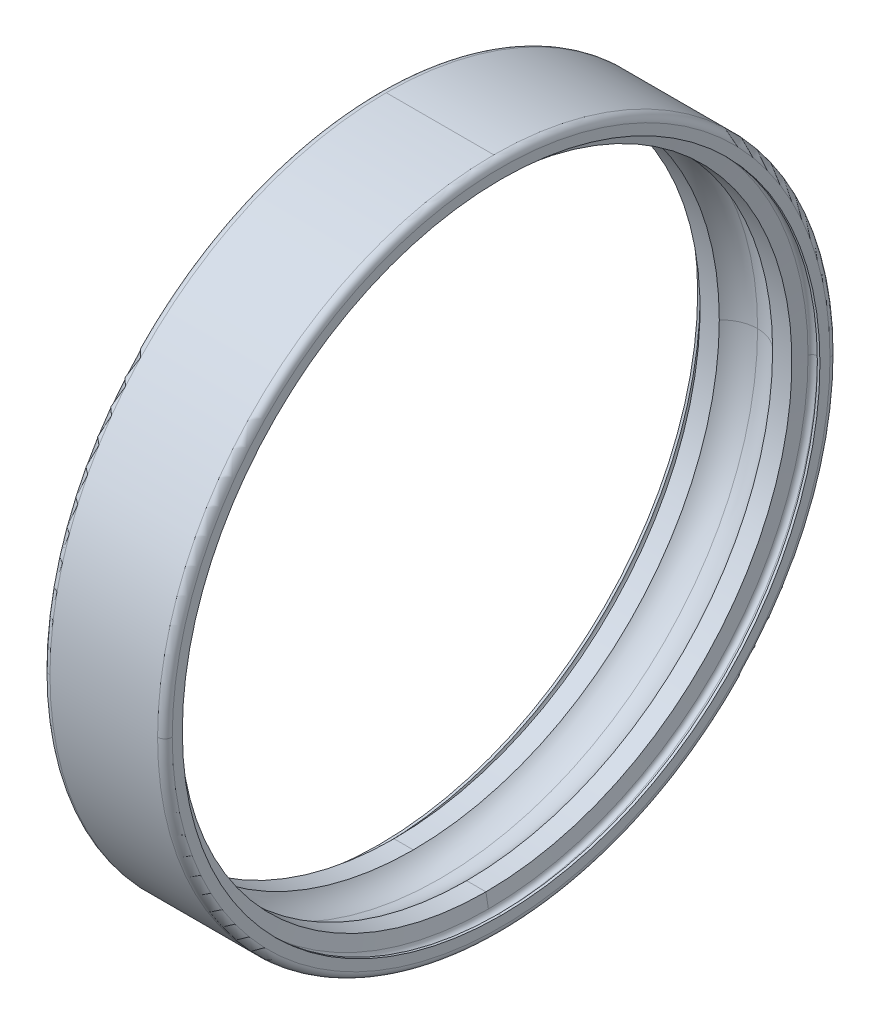
ISO-10303-21;
HEADER;
FILE_DESCRIPTION(('STEP AP214'),'2;1');
FILE_NAME('part.step','',(''),(''),'','','');
FILE_SCHEMA(('AUTOMOTIVE_DESIGN { 1 0 10303 214 1 1 1 1 }'));
ENDSEC;
DATA;
#1=APPLICATION_CONTEXT('core data for automotive mechanical design processes');
#2=APPLICATION_PROTOCOL_DEFINITION('international standard','automotive_design',2000,#1);
#3=PRODUCT_CONTEXT('',#1,'mechanical');
#4=PRODUCT('Part','Part','',(#3));
#5=PRODUCT_RELATED_PRODUCT_CATEGORY('part','',(#4));
#6=PRODUCT_DEFINITION_FORMATION('','',#4);
#7=PRODUCT_DEFINITION_CONTEXT('part definition',#1,'design');
#8=PRODUCT_DEFINITION('design','',#6,#7);
#9=PRODUCT_DEFINITION_SHAPE('','',#8);
#10=(LENGTH_UNIT() NAMED_UNIT(*) SI_UNIT(.MILLI.,.METRE.));
#11=(NAMED_UNIT(*) PLANE_ANGLE_UNIT() SI_UNIT($,.RADIAN.));
#12=(NAMED_UNIT(*) SI_UNIT($,.STERADIAN.) SOLID_ANGLE_UNIT());
#13=UNCERTAINTY_MEASURE_WITH_UNIT(LENGTH_MEASURE(1.E-05),#10,'distance_accuracy_value','');
#14=(GEOMETRIC_REPRESENTATION_CONTEXT(3) GLOBAL_UNCERTAINTY_ASSIGNED_CONTEXT((#13)) GLOBAL_UNIT_ASSIGNED_CONTEXT((#10,
#11,#12)) REPRESENTATION_CONTEXT('',''));
#15=CARTESIAN_POINT('',(0.,0.,0.));
#16=DIRECTION('',(0.,0.,1.));
#17=DIRECTION('',(1.,0.,0.));
#18=AXIS2_PLACEMENT_3D('',#15,#16,#17);
#19=CARTESIAN_POINT('',(9.37,0.,0.));
#20=DIRECTION('',(1.,0.,0.));
#21=DIRECTION('',(0.,0.,-1.));
#22=AXIS2_PLACEMENT_3D('',#19,#20,#21);
#23=TOROIDAL_SURFACE('',#22,26.075,0.42);
#24=CARTESIAN_POINT('',(9.37,0.,0.));
#25=DIRECTION('',(1.,0.,0.));
#26=DIRECTION('',(0.,0.,1.));
#27=AXIS2_PLACEMENT_3D('',#24,#25,#26);
#28=CIRCLE('',#27,26.495);
#29=CARTESIAN_POINT('',(9.37,0.,-26.495));
#30=VERTEX_POINT('',#29);
#31=CARTESIAN_POINT('',(9.37,0.,26.495));
#32=VERTEX_POINT('',#31);
#33=EDGE_CURVE('E434',#30,#32,#28,.T.);
#34=ORIENTED_EDGE('',*,*,#33,.T.);
#35=CARTESIAN_POINT('',(9.37,0.,26.075));
#36=DIRECTION('',(0.,-1.,0.));
#37=DIRECTION('',(0.,0.,1.));
#38=AXIS2_PLACEMENT_3D('',#35,#36,#37);
#39=CIRCLE('',#38,0.42);
#40=CARTESIAN_POINT('',(8.95638074373487,0.,26.1479322346201));
#41=VERTEX_POINT('',#40);
#42=EDGE_CURVE('E278',#32,#41,#39,.T.);
#43=ORIENTED_EDGE('',*,*,#42,.T.);
#44=CARTESIAN_POINT('',(8.95638074373487,0.,0.));
#45=DIRECTION('',(1.,0.,0.));
#46=DIRECTION('',(0.,1.,0.));
#47=AXIS2_PLACEMENT_3D('',#44,#45,#46);
#48=CIRCLE('',#47,26.1479322346201);
#49=CARTESIAN_POINT('',(8.95638074373487,26.1479322346201,0.));
#50=VERTEX_POINT('',#49);
#51=EDGE_CURVE('E31',#50,#41,#48,.T.);
#52=ORIENTED_EDGE('',*,*,#51,.F.);
#53=CARTESIAN_POINT('',(8.95638074373487,0.,0.));
#54=DIRECTION('',(1.,0.,0.));
#55=DIRECTION('',(0.,1.,0.));
#56=AXIS2_PLACEMENT_3D('',#53,#54,#55);
#57=CIRCLE('',#56,26.1479322346201);
#58=CARTESIAN_POINT('',(8.95638074373487,0.,-26.1479322346201));
#59=VERTEX_POINT('',#58);
#60=EDGE_CURVE('E220',#59,#50,#57,.T.);
#61=ORIENTED_EDGE('',*,*,#60,.F.);
#62=CARTESIAN_POINT('',(9.37,0.,-26.075));
#63=DIRECTION('',(0.,-1.,0.));
#64=DIRECTION('',(0.,0.,-1.));
#65=AXIS2_PLACEMENT_3D('',#62,#63,#64);
#66=CIRCLE('',#65,0.42);
#67=EDGE_CURVE('E410',#59,#30,#66,.T.);
#68=ORIENTED_EDGE('',*,*,#67,.T.);
#69=EDGE_LOOP('',(#34,#43,#52,#61,#68));
#70=FACE_BOUND('',#69,.T.);
#71=ADVANCED_FACE('F15',(#70),#23,.F.);
#72=CARTESIAN_POINT('',(9.895,0.,0.));
#73=DIRECTION('',(1.,0.,0.));
#74=DIRECTION('',(0.,1.,0.));
#75=AXIS2_PLACEMENT_3D('',#72,#73,#74);
#76=CYLINDRICAL_SURFACE('',#75,26.075);
#77=DIRECTION('',(1.,0.,0.));
#78=VECTOR('',#77,1.);
#79=CARTESIAN_POINT('',(9.895,26.075,0.));
#80=LINE('',#79,#78);
#81=CARTESIAN_POINT('',(9.79,26.075,0.));
#82=VERTEX_POINT('',#81);
#83=CARTESIAN_POINT('',(10.,26.075,0.));
#84=VERTEX_POINT('',#83);
#85=EDGE_CURVE('E279',#82,#84,#80,.T.);
#86=ORIENTED_EDGE('',*,*,#85,.T.);
#87=CARTESIAN_POINT('',(10.,0.,0.));
#88=DIRECTION('',(1.,0.,0.));
#89=DIRECTION('',(0.,1.,0.));
#90=AXIS2_PLACEMENT_3D('',#87,#88,#89);
#91=CIRCLE('',#90,26.075);
#92=CARTESIAN_POINT('',(10.,-26.075,0.));
#93=VERTEX_POINT('',#92);
#94=EDGE_CURVE('E10',#84,#93,#91,.T.);
#95=ORIENTED_EDGE('',*,*,#94,.T.);
#96=DIRECTION('',(-1.,0.,0.));
#97=VECTOR('',#96,1.);
#98=CARTESIAN_POINT('',(9.895,-26.075,0.));
#99=LINE('',#98,#97);
#100=CARTESIAN_POINT('',(9.79,-26.075,0.));
#101=VERTEX_POINT('',#100);
#102=EDGE_CURVE('E283',#93,#101,#99,.T.);
#103=ORIENTED_EDGE('',*,*,#102,.T.);
#104=CARTESIAN_POINT('',(9.79,0.,0.));
#105=DIRECTION('',(1.,0.,0.));
#106=DIRECTION('',(0.,1.,0.));
#107=AXIS2_PLACEMENT_3D('',#104,#105,#106);
#108=CIRCLE('',#107,26.075);
#109=CARTESIAN_POINT('',(9.79,0.,26.075));
#110=VERTEX_POINT('',#109);
#111=EDGE_CURVE('E405',#110,#101,#108,.T.);
#112=ORIENTED_EDGE('',*,*,#111,.F.);
#113=CARTESIAN_POINT('',(9.79,0.,0.));
#114=DIRECTION('',(1.,0.,0.));
#115=DIRECTION('',(0.,1.,0.));
#116=AXIS2_PLACEMENT_3D('',#113,#114,#115);
#117=CIRCLE('',#116,26.075);
#118=EDGE_CURVE('E355',#82,#110,#117,.T.);
#119=ORIENTED_EDGE('',*,*,#118,.F.);
#120=EDGE_LOOP('',(#86,#95,#103,#112,#119));
#121=FACE_BOUND('',#120,.T.);
#122=ADVANCED_FACE('F17',(#121),#76,.F.);
#123=CARTESIAN_POINT('',(10.,26.4875,0.));
#124=DIRECTION('',(1.,0.,0.));
#125=DIRECTION('',(0.,1.,0.));
#126=AXIS2_PLACEMENT_3D('',#123,#124,#125);
#127=PLANE('',#126);
#128=ORIENTED_EDGE('',*,*,#94,.F.);
#129=CARTESIAN_POINT('',(10.,0.,0.));
#130=DIRECTION('',(1.,0.,0.));
#131=DIRECTION('',(0.,1.,0.));
#132=AXIS2_PLACEMENT_3D('',#129,#130,#131);
#133=CIRCLE('',#132,26.075);
#134=EDGE_CURVE('E286',#93,#84,#133,.T.);
#135=ORIENTED_EDGE('',*,*,#134,.F.);
#136=EDGE_LOOP('',(#128,#135));
#137=FACE_BOUND('',#136,.T.);
#138=CARTESIAN_POINT('',(10.,0.,0.));
#139=DIRECTION('',(1.,0.,0.));
#140=DIRECTION('',(0.,1.,0.));
#141=AXIS2_PLACEMENT_3D('',#138,#139,#140);
#142=CIRCLE('',#141,26.9);
#143=CARTESIAN_POINT('',(10.,0.,26.9));
#144=VERTEX_POINT('',#143);
#145=CARTESIAN_POINT('',(10.,0.,-26.9));
#146=VERTEX_POINT('',#145);
#147=EDGE_CURVE('E19',#144,#146,#142,.T.);
#148=ORIENTED_EDGE('',*,*,#147,.T.);
#149=CARTESIAN_POINT('',(10.,0.,0.));
#150=DIRECTION('',(1.,0.,0.));
#151=DIRECTION('',(0.,1.,0.));
#152=AXIS2_PLACEMENT_3D('',#149,#150,#151);
#153=CIRCLE('',#152,26.9);
#154=EDGE_CURVE('E301',#146,#144,#153,.T.);
#155=ORIENTED_EDGE('',*,*,#154,.T.);
#156=EDGE_LOOP('',(#148,#155));
#157=FACE_BOUND('',#156,.T.);
#158=ADVANCED_FACE('F455',(#137,#157),#127,.T.);
#159=CARTESIAN_POINT('',(9.4,0.,0.));
#160=DIRECTION('',(1.,0.,0.));
#161=DIRECTION('',(0.,0.,-1.));
#162=AXIS2_PLACEMENT_3D('',#159,#160,#161);
#163=TOROIDAL_SURFACE('',#162,26.9,0.6);
#164=CARTESIAN_POINT('',(9.4,0.,-26.9));
#165=DIRECTION('',(0.,-1.,0.));
#166=DIRECTION('',(0.,0.,-1.));
#167=AXIS2_PLACEMENT_3D('',#164,#165,#166);
#168=CIRCLE('',#167,0.6);
#169=CARTESIAN_POINT('',(9.4,0.,-27.5));
#170=VERTEX_POINT('',#169);
#171=EDGE_CURVE('E289',#170,#146,#168,.T.);
#172=ORIENTED_EDGE('',*,*,#171,.T.);
#173=ORIENTED_EDGE('',*,*,#147,.F.);
#174=CARTESIAN_POINT('',(9.4,0.,26.9));
#175=DIRECTION('',(0.,-1.,0.));
#176=DIRECTION('',(0.,0.,1.));
#177=AXIS2_PLACEMENT_3D('',#174,#175,#176);
#178=CIRCLE('',#177,0.6);
#179=CARTESIAN_POINT('',(9.4,0.,27.5));
#180=VERTEX_POINT('',#179);
#181=EDGE_CURVE('E298',#144,#180,#178,.T.);
#182=ORIENTED_EDGE('',*,*,#181,.T.);
#183=CARTESIAN_POINT('',(9.4,0.,0.));
#184=DIRECTION('',(1.,0.,0.));
#185=DIRECTION('',(0.,1.,0.));
#186=AXIS2_PLACEMENT_3D('',#183,#184,#185);
#187=CIRCLE('',#186,27.5);
#188=CARTESIAN_POINT('',(9.4,-27.5,0.));
#189=VERTEX_POINT('',#188);
#190=EDGE_CURVE('E314',#180,#189,#187,.T.);
#191=ORIENTED_EDGE('',*,*,#190,.T.);
#192=CARTESIAN_POINT('',(9.4,0.,0.));
#193=DIRECTION('',(1.,0.,0.));
#194=DIRECTION('',(0.,1.,0.));
#195=AXIS2_PLACEMENT_3D('',#192,#193,#194);
#196=CIRCLE('',#195,27.5);
#197=EDGE_CURVE('E223',#189,#170,#196,.T.);
#198=ORIENTED_EDGE('',*,*,#197,.T.);
#199=EDGE_LOOP('',(#172,#173,#182,#191,#198));
#200=FACE_BOUND('',#199,.T.);
#201=ADVANCED_FACE('F487',(#200),#163,.T.);
#202=CARTESIAN_POINT('',(5.,0.,0.));
#203=DIRECTION('',(1.,0.,0.));
#204=DIRECTION('',(0.,1.,0.));
#205=AXIS2_PLACEMENT_3D('',#202,#203,#204);
#206=CYLINDRICAL_SURFACE('',#205,27.5);
#207=DIRECTION('',(1.,0.,0.));
#208=VECTOR('',#207,1.);
#209=CARTESIAN_POINT('',(5.,27.5,0.));
#210=LINE('',#209,#208);
#211=CARTESIAN_POINT('',(0.6,27.5,0.));
#212=VERTEX_POINT('',#211);
#213=CARTESIAN_POINT('',(9.4,27.5,0.));
#214=VERTEX_POINT('',#213);
#215=EDGE_CURVE('E304',#212,#214,#210,.T.);
#216=ORIENTED_EDGE('',*,*,#215,.T.);
#217=CARTESIAN_POINT('',(9.4,0.,0.));
#218=DIRECTION('',(1.,0.,0.));
#219=DIRECTION('',(0.,1.,0.));
#220=AXIS2_PLACEMENT_3D('',#217,#218,#219);
#221=CIRCLE('',#220,27.5);
#222=EDGE_CURVE('E292',#170,#214,#221,.T.);
#223=ORIENTED_EDGE('',*,*,#222,.F.);
#224=ORIENTED_EDGE('',*,*,#197,.F.);
#225=DIRECTION('',(-1.,0.,0.));
#226=VECTOR('',#225,1.);
#227=CARTESIAN_POINT('',(5.,-27.5,0.));
#228=LINE('',#227,#226);
#229=CARTESIAN_POINT('',(0.6,-27.5,0.));
#230=VERTEX_POINT('',#229);
#231=EDGE_CURVE('E309',#189,#230,#228,.T.);
#232=ORIENTED_EDGE('',*,*,#231,.T.);
#233=CARTESIAN_POINT('',(0.6,0.,0.));
#234=DIRECTION('',(1.,0.,0.));
#235=DIRECTION('',(0.,1.,0.));
#236=AXIS2_PLACEMENT_3D('',#233,#234,#235);
#237=CIRCLE('',#236,27.5);
#238=CARTESIAN_POINT('',(0.6,0.,-27.5));
#239=VERTEX_POINT('',#238);
#240=EDGE_CURVE('E222',#230,#239,#237,.T.);
#241=ORIENTED_EDGE('',*,*,#240,.T.);
#242=CARTESIAN_POINT('',(0.6,0.,0.));
#243=DIRECTION('',(1.,0.,0.));
#244=DIRECTION('',(0.,1.,0.));
#245=AXIS2_PLACEMENT_3D('',#242,#243,#244);
#246=CIRCLE('',#245,27.5);
#247=EDGE_CURVE('E239',#239,#212,#246,.T.);
#248=ORIENTED_EDGE('',*,*,#247,.T.);
#249=EDGE_LOOP('',(#216,#223,#224,#232,#241,#248));
#250=FACE_BOUND('',#249,.T.);
#251=ADVANCED_FACE('F484',(#250),#206,.T.);
#252=CARTESIAN_POINT('',(0.6,0.,0.));
#253=DIRECTION('',(1.,0.,0.));
#254=DIRECTION('',(0.,0.,-1.));
#255=AXIS2_PLACEMENT_3D('',#252,#253,#254);
#256=TOROIDAL_SURFACE('',#255,26.9,0.6);
#257=CARTESIAN_POINT('',(0.6,0.,-26.9));
#258=DIRECTION('',(0.,-1.,0.));
#259=DIRECTION('',(0.,0.,-1.));
#260=AXIS2_PLACEMENT_3D('',#257,#258,#259);
#261=CIRCLE('',#260,0.6);
#262=CARTESIAN_POINT('',(0.,0.,-26.9));
#263=VERTEX_POINT('',#262);
#264=EDGE_CURVE('E311',#263,#239,#261,.T.);
#265=ORIENTED_EDGE('',*,*,#264,.T.);
#266=ORIENTED_EDGE('',*,*,#240,.F.);
#267=CARTESIAN_POINT('',(0.6,0.,0.));
#268=DIRECTION('',(1.,0.,0.));
#269=DIRECTION('',(0.,1.,0.));
#270=AXIS2_PLACEMENT_3D('',#267,#268,#269);
#271=CIRCLE('',#270,27.5);
#272=CARTESIAN_POINT('',(0.6,0.,27.5));
#273=VERTEX_POINT('',#272);
#274=EDGE_CURVE('E307',#273,#230,#271,.T.);
#275=ORIENTED_EDGE('',*,*,#274,.F.);
#276=CARTESIAN_POINT('',(0.6,0.,26.9));
#277=DIRECTION('',(0.,-1.,0.));
#278=DIRECTION('',(0.,0.,1.));
#279=AXIS2_PLACEMENT_3D('',#276,#277,#278);
#280=CIRCLE('',#279,0.6);
#281=CARTESIAN_POINT('',(0.,0.,26.9));
#282=VERTEX_POINT('',#281);
#283=EDGE_CURVE('E318',#273,#282,#280,.T.);
#284=ORIENTED_EDGE('',*,*,#283,.T.);
#285=CARTESIAN_POINT('',(0.,0.,0.));
#286=DIRECTION('',(1.,0.,0.));
#287=DIRECTION('',(0.,1.,0.));
#288=AXIS2_PLACEMENT_3D('',#285,#286,#287);
#289=CIRCLE('',#288,26.9);
#290=EDGE_CURVE('E224',#282,#263,#289,.T.);
#291=ORIENTED_EDGE('',*,*,#290,.T.);
#292=EDGE_LOOP('',(#265,#266,#275,#284,#291));
#293=FACE_BOUND('',#292,.T.);
#294=ADVANCED_FACE('F481',(#293),#256,.T.);
#295=CARTESIAN_POINT('',(0.,26.4875,0.));
#296=DIRECTION('',(-1.,0.,0.));
#297=DIRECTION('',(0.,0.,1.));
#298=AXIS2_PLACEMENT_3D('',#295,#296,#297);
#299=PLANE('',#298);
#300=CARTESIAN_POINT('',(0.,0.,0.));
#301=DIRECTION('',(1.,0.,0.));
#302=DIRECTION('',(0.,1.,0.));
#303=AXIS2_PLACEMENT_3D('',#300,#301,#302);
#304=CIRCLE('',#303,26.075);
#305=CARTESIAN_POINT('',(0.,26.075,0.));
#306=VERTEX_POINT('',#305);
#307=CARTESIAN_POINT('',(0.,-26.075,0.));
#308=VERTEX_POINT('',#307);
#309=EDGE_CURVE('E229',#306,#308,#304,.T.);
#310=ORIENTED_EDGE('',*,*,#309,.T.);
#311=CARTESIAN_POINT('',(0.,0.,0.));
#312=DIRECTION('',(1.,0.,0.));
#313=DIRECTION('',(0.,1.,0.));
#314=AXIS2_PLACEMENT_3D('',#311,#312,#313);
#315=CIRCLE('',#314,26.075);
#316=EDGE_CURVE('E241',#308,#306,#315,.T.);
#317=ORIENTED_EDGE('',*,*,#316,.T.);
#318=EDGE_LOOP('',(#310,#317));
#319=FACE_BOUND('',#318,.T.);
#320=CARTESIAN_POINT('',(0.,0.,0.));
#321=DIRECTION('',(1.,0.,0.));
#322=DIRECTION('',(0.,1.,0.));
#323=AXIS2_PLACEMENT_3D('',#320,#321,#322);
#324=CIRCLE('',#323,26.9);
#325=EDGE_CURVE('E313',#263,#282,#324,.T.);
#326=ORIENTED_EDGE('',*,*,#325,.F.);
#327=ORIENTED_EDGE('',*,*,#290,.F.);
#328=EDGE_LOOP('',(#326,#327));
#329=FACE_BOUND('',#328,.T.);
#330=ADVANCED_FACE('F341',(#319,#329),#299,.T.);
#331=CARTESIAN_POINT('',(0.105,0.,0.));
#332=DIRECTION('',(1.,0.,0.));
#333=DIRECTION('',(0.,1.,0.));
#334=AXIS2_PLACEMENT_3D('',#331,#332,#333);
#335=CYLINDRICAL_SURFACE('',#334,26.075);
#336=DIRECTION('',(1.,0.,0.));
#337=VECTOR('',#336,1.);
#338=CARTESIAN_POINT('',(0.105,26.075,0.));
#339=LINE('',#338,#337);
#340=CARTESIAN_POINT('',(0.21,26.075,0.));
#341=VERTEX_POINT('',#340);
#342=EDGE_CURVE('E245',#306,#341,#339,.T.);
#343=ORIENTED_EDGE('',*,*,#342,.T.);
#344=CARTESIAN_POINT('',(0.21,0.,0.));
#345=DIRECTION('',(1.,0.,0.));
#346=DIRECTION('',(0.,1.,0.));
#347=AXIS2_PLACEMENT_3D('',#344,#345,#346);
#348=CIRCLE('',#347,26.075);
#349=CARTESIAN_POINT('',(0.21,0.,26.075));
#350=VERTEX_POINT('',#349);
#351=EDGE_CURVE('E235',#341,#350,#348,.T.);
#352=ORIENTED_EDGE('',*,*,#351,.T.);
#353=CARTESIAN_POINT('',(0.21,0.,0.));
#354=DIRECTION('',(1.,0.,0.));
#355=DIRECTION('',(0.,1.,0.));
#356=AXIS2_PLACEMENT_3D('',#353,#354,#355);
#357=CIRCLE('',#356,26.075);
#358=CARTESIAN_POINT('',(0.21,-26.075,0.));
#359=VERTEX_POINT('',#358);
#360=EDGE_CURVE('E256',#350,#359,#357,.T.);
#361=ORIENTED_EDGE('',*,*,#360,.T.);
#362=DIRECTION('',(-1.,0.,0.));
#363=VECTOR('',#362,1.);
#364=CARTESIAN_POINT('',(0.105,-26.075,0.));
#365=LINE('',#364,#363);
#366=EDGE_CURVE('E244',#359,#308,#365,.T.);
#367=ORIENTED_EDGE('',*,*,#366,.T.);
#368=ORIENTED_EDGE('',*,*,#309,.F.);
#369=EDGE_LOOP('',(#343,#352,#361,#367,#368));
#370=FACE_BOUND('',#369,.T.);
#371=ADVANCED_FACE('F321',(#370),#335,.F.);
#372=CARTESIAN_POINT('',(0.63,0.,0.));
#373=DIRECTION('',(1.,0.,0.));
#374=DIRECTION('',(0.,0.,-1.));
#375=AXIS2_PLACEMENT_3D('',#372,#373,#374);
#376=TOROIDAL_SURFACE('',#375,26.075,0.42);
#377=CARTESIAN_POINT('',(0.63,0.,0.));
#378=DIRECTION('',(1.,0.,0.));
#379=DIRECTION('',(0.,0.,1.));
#380=AXIS2_PLACEMENT_3D('',#377,#378,#379);
#381=CIRCLE('',#380,26.495);
#382=CARTESIAN_POINT('',(0.63,0.,-26.495));
#383=VERTEX_POINT('',#382);
#384=CARTESIAN_POINT('',(0.63,0.,26.495));
#385=VERTEX_POINT('',#384);
#386=EDGE_CURVE('E331',#383,#385,#381,.T.);
#387=ORIENTED_EDGE('',*,*,#386,.T.);
#388=CARTESIAN_POINT('',(0.63,0.,26.075));
#389=DIRECTION('',(0.,-1.,0.));
#390=DIRECTION('',(0.,0.,1.));
#391=AXIS2_PLACEMENT_3D('',#388,#389,#390);
#392=CIRCLE('',#391,0.42);
#393=EDGE_CURVE('E258',#385,#350,#392,.T.);
#394=ORIENTED_EDGE('',*,*,#393,.T.);
#395=ORIENTED_EDGE('',*,*,#351,.F.);
#396=CARTESIAN_POINT('',(0.21,0.,0.));
#397=DIRECTION('',(1.,0.,0.));
#398=DIRECTION('',(0.,1.,0.));
#399=AXIS2_PLACEMENT_3D('',#396,#397,#398);
#400=CIRCLE('',#399,26.075);
#401=CARTESIAN_POINT('',(0.21,0.,-26.075));
#402=VERTEX_POINT('',#401);
#403=EDGE_CURVE('E251',#402,#341,#400,.T.);
#404=ORIENTED_EDGE('',*,*,#403,.F.);
#405=CARTESIAN_POINT('',(0.63,0.,-26.075));
#406=DIRECTION('',(0.,-1.,0.));
#407=DIRECTION('',(0.,0.,-1.));
#408=AXIS2_PLACEMENT_3D('',#405,#406,#407);
#409=CIRCLE('',#408,0.42);
#410=EDGE_CURVE('E254',#402,#383,#409,.T.);
#411=ORIENTED_EDGE('',*,*,#410,.T.);
#412=EDGE_LOOP('',(#387,#394,#395,#404,#411));
#413=FACE_BOUND('',#412,.T.);
#414=ADVANCED_FACE('F329',(#413),#376,.F.);
#415=CARTESIAN_POINT('',(1.14262088150052,0.,0.));
#416=DIRECTION('',(-1.,0.,0.));
#417=DIRECTION('',(0.,1.,0.));
#418=AXIS2_PLACEMENT_3D('',#415,#416,#417);
#419=CONICAL_SURFACE('',#418,25.5864661173101,1.39626340159546);
#420=DIRECTION('',(0.17364817766693,-0.984807753012208,0.));
#421=VECTOR('',#420,1.);
#422=CARTESIAN_POINT('',(1.14262088150052,25.5864661173101,0.));
#423=LINE('',#422,#421);
#424=CARTESIAN_POINT('',(1.04361925626513,26.1479322346201,0.));
#425=VERTEX_POINT('',#424);
#426=CARTESIAN_POINT('',(1.2416225067359,25.025,0.));
#427=VERTEX_POINT('',#426);
#428=EDGE_CURVE('E261',#425,#427,#423,.T.);
#429=ORIENTED_EDGE('',*,*,#428,.T.);
#430=CARTESIAN_POINT('',(1.2416225067359,0.,0.));
#431=DIRECTION('',(1.,0.,0.));
#432=DIRECTION('',(0.,1.,0.));
#433=AXIS2_PLACEMENT_3D('',#430,#431,#432);
#434=CIRCLE('',#433,25.025);
#435=CARTESIAN_POINT('',(1.2416225067359,-25.025,0.));
#436=VERTEX_POINT('',#435);
#437=EDGE_CURVE('E189',#427,#436,#434,.T.);
#438=ORIENTED_EDGE('',*,*,#437,.T.);
#439=DIRECTION('',(-0.17364817766693,-0.984807753012208,0.));
#440=VECTOR('',#439,1.);
#441=CARTESIAN_POINT('',(1.14262088150052,-25.5864661173101,0.));
#442=LINE('',#441,#440);
#443=CARTESIAN_POINT('',(1.04361925626513,-26.1479322346201,0.));
#444=VERTEX_POINT('',#443);
#445=EDGE_CURVE('E264',#436,#444,#442,.T.);
#446=ORIENTED_EDGE('',*,*,#445,.T.);
#447=CARTESIAN_POINT('',(1.04361925626513,0.,0.));
#448=DIRECTION('',(1.,0.,0.));
#449=DIRECTION('',(0.,1.,0.));
#450=AXIS2_PLACEMENT_3D('',#447,#448,#449);
#451=CIRCLE('',#450,26.1479322346201);
#452=CARTESIAN_POINT('',(1.04361925626513,0.,26.1479322346201));
#453=VERTEX_POINT('',#452);
#454=EDGE_CURVE('E397',#453,#444,#451,.T.);
#455=ORIENTED_EDGE('',*,*,#454,.F.);
#456=CARTESIAN_POINT('',(1.04361925626513,0.,0.));
#457=DIRECTION('',(1.,0.,0.));
#458=DIRECTION('',(0.,1.,0.));
#459=AXIS2_PLACEMENT_3D('',#456,#457,#458);
#460=CIRCLE('',#459,26.1479322346201);
#461=EDGE_CURVE('E379',#425,#453,#460,.T.);
#462=ORIENTED_EDGE('',*,*,#461,.F.);
#463=EDGE_LOOP('',(#429,#438,#446,#455,#462));
#464=FACE_BOUND('',#463,.T.);
#465=ADVANCED_FACE('F473',(#464),#419,.F.);
#466=CARTESIAN_POINT('',(2.03006297236999,0.,0.));
#467=DIRECTION('',(1.,0.,0.));
#468=DIRECTION('',(0.,1.,0.));
#469=AXIS2_PLACEMENT_3D('',#466,#467,#468);
#470=CYLINDRICAL_SURFACE('',#469,25.025);
#471=DIRECTION('',(1.,0.,0.));
#472=VECTOR('',#471,1.);
#473=CARTESIAN_POINT('',(2.03006297236999,25.025,0.));
#474=LINE('',#473,#472);
#475=CARTESIAN_POINT('',(2.81850343800407,25.025,0.));
#476=VERTEX_POINT('',#475);
#477=EDGE_CURVE('E185',#427,#476,#474,.T.);
#478=ORIENTED_EDGE('',*,*,#477,.T.);
#479=CARTESIAN_POINT('',(2.81850343800407,0.,0.));
#480=DIRECTION('',(1.,0.,0.));
#481=DIRECTION('',(0.,1.,0.));
#482=AXIS2_PLACEMENT_3D('',#479,#480,#481);
#483=CIRCLE('',#482,25.025);
#484=CARTESIAN_POINT('',(2.81850343800407,0.,25.025));
#485=VERTEX_POINT('',#484);
#486=EDGE_CURVE('E177',#476,#485,#483,.T.);
#487=ORIENTED_EDGE('',*,*,#486,.T.);
#488=CARTESIAN_POINT('',(2.81850343800407,0.,0.));
#489=DIRECTION('',(1.,0.,0.));
#490=DIRECTION('',(0.,1.,0.));
#491=AXIS2_PLACEMENT_3D('',#488,#489,#490);
#492=CIRCLE('',#491,25.025);
#493=CARTESIAN_POINT('',(2.81850343800407,-25.025,0.));
#494=VERTEX_POINT('',#493);
#495=EDGE_CURVE('E182',#485,#494,#492,.T.);
#496=ORIENTED_EDGE('',*,*,#495,.T.);
#497=DIRECTION('',(-1.,0.,0.));
#498=VECTOR('',#497,1.);
#499=CARTESIAN_POINT('',(2.03006297236999,-25.025,0.));
#500=LINE('',#499,#498);
#501=EDGE_CURVE('E268',#494,#436,#500,.T.);
#502=ORIENTED_EDGE('',*,*,#501,.T.);
#503=ORIENTED_EDGE('',*,*,#437,.F.);
#504=EDGE_LOOP('',(#478,#487,#496,#502,#503));
#505=FACE_BOUND('',#504,.T.);
#506=ADVANCED_FACE('F179',(#505),#470,.F.);
#507=CARTESIAN_POINT('',(5.,0.,0.));
#508=DIRECTION('',(1.,0.,0.));
#509=DIRECTION('',(0.,0.,-1.));
#510=AXIS2_PLACEMENT_3D('',#507,#508,#509);
#511=TOROIDAL_SURFACE('',#510,23.,2.9765);
#512=CARTESIAN_POINT('',(5.,0.,0.));
#513=DIRECTION('',(1.,0.,0.));
#514=DIRECTION('',(0.,0.,1.));
#515=AXIS2_PLACEMENT_3D('',#512,#513,#514);
#516=CIRCLE('',#515,25.9765);
#517=CARTESIAN_POINT('',(5.,0.,-25.9765));
#518=VERTEX_POINT('',#517);
#519=CARTESIAN_POINT('',(5.,0.,25.9765));
#520=VERTEX_POINT('',#519);
#521=EDGE_CURVE('E195',#518,#520,#516,.T.);
#522=ORIENTED_EDGE('',*,*,#521,.T.);
#523=CARTESIAN_POINT('',(5.,0.,23.));
#524=DIRECTION('',(0.,-1.,0.));
#525=DIRECTION('',(0.,0.,1.));
#526=AXIS2_PLACEMENT_3D('',#523,#524,#525);
#527=CIRCLE('',#526,2.9765);
#528=EDGE_CURVE('E192',#520,#485,#527,.T.);
#529=ORIENTED_EDGE('',*,*,#528,.T.);
#530=ORIENTED_EDGE('',*,*,#486,.F.);
#531=CARTESIAN_POINT('',(2.81850343800407,0.,0.));
#532=DIRECTION('',(1.,0.,0.));
#533=DIRECTION('',(0.,1.,0.));
#534=AXIS2_PLACEMENT_3D('',#531,#532,#533);
#535=CIRCLE('',#534,25.025);
#536=CARTESIAN_POINT('',(2.81850343800407,0.,-25.025));
#537=VERTEX_POINT('',#536);
#538=EDGE_CURVE('E207',#537,#476,#535,.T.);
#539=ORIENTED_EDGE('',*,*,#538,.F.);
#540=CARTESIAN_POINT('',(5.,0.,-23.));
#541=DIRECTION('',(0.,-1.,0.));
#542=DIRECTION('',(0.,0.,-1.));
#543=AXIS2_PLACEMENT_3D('',#540,#541,#542);
#544=CIRCLE('',#543,2.9765);
#545=EDGE_CURVE('E205',#537,#518,#544,.T.);
#546=ORIENTED_EDGE('',*,*,#545,.T.);
#547=EDGE_LOOP('',(#522,#529,#530,#539,#546));
#548=FACE_BOUND('',#547,.T.);
#549=ADVANCED_FACE('F193',(#548),#511,.F.);
#550=CARTESIAN_POINT('',(7.96993702763001,0.,0.));
#551=DIRECTION('',(1.,0.,0.));
#552=DIRECTION('',(0.,1.,0.));
#553=AXIS2_PLACEMENT_3D('',#550,#551,#552);
#554=CYLINDRICAL_SURFACE('',#553,25.025);
#555=DIRECTION('',(1.,0.,0.));
#556=VECTOR('',#555,1.);
#557=CARTESIAN_POINT('',(7.96993702763001,25.025,0.));
#558=LINE('',#557,#556);
#559=CARTESIAN_POINT('',(7.18149656199593,25.025,0.));
#560=VERTEX_POINT('',#559);
#561=CARTESIAN_POINT('',(8.75837749326409,25.025,0.));
#562=VERTEX_POINT('',#561);
#563=EDGE_CURVE('E199',#560,#562,#558,.T.);
#564=ORIENTED_EDGE('',*,*,#563,.T.);
#565=CARTESIAN_POINT('',(8.75837749326409,0.,0.));
#566=DIRECTION('',(1.,0.,0.));
#567=DIRECTION('',(0.,1.,0.));
#568=AXIS2_PLACEMENT_3D('',#565,#566,#567);
#569=CIRCLE('',#568,25.025);
#570=CARTESIAN_POINT('',(8.7583774932641,-25.025,0.));
#571=VERTEX_POINT('',#570);
#572=EDGE_CURVE('E40',#562,#571,#569,.T.);
#573=ORIENTED_EDGE('',*,*,#572,.T.);
#574=DIRECTION('',(-1.,0.,0.));
#575=VECTOR('',#574,1.);
#576=CARTESIAN_POINT('',(7.96993702763001,-25.025,0.));
#577=LINE('',#576,#575);
#578=CARTESIAN_POINT('',(7.18149656199593,-25.025,0.));
#579=VERTEX_POINT('',#578);
#580=EDGE_CURVE('E215',#571,#579,#577,.T.);
#581=ORIENTED_EDGE('',*,*,#580,.T.);
#582=CARTESIAN_POINT('',(7.18149656199593,0.,0.));
#583=DIRECTION('',(1.,0.,0.));
#584=DIRECTION('',(0.,1.,0.));
#585=AXIS2_PLACEMENT_3D('',#582,#583,#584);
#586=CIRCLE('',#585,25.025);
#587=CARTESIAN_POINT('',(7.18149656199593,0.,25.025));
#588=VERTEX_POINT('',#587);
#589=EDGE_CURVE('E389',#588,#579,#586,.T.);
#590=ORIENTED_EDGE('',*,*,#589,.F.);
#591=CARTESIAN_POINT('',(7.18149656199593,0.,0.));
#592=DIRECTION('',(1.,0.,0.));
#593=DIRECTION('',(0.,1.,0.));
#594=AXIS2_PLACEMENT_3D('',#591,#592,#593);
#595=CIRCLE('',#594,25.025);
#596=EDGE_CURVE('E346',#560,#588,#595,.T.);
#597=ORIENTED_EDGE('',*,*,#596,.F.);
#598=EDGE_LOOP('',(#564,#573,#581,#590,#597));
#599=FACE_BOUND('',#598,.T.);
#600=ADVANCED_FACE('F441',(#599),#554,.F.);
#601=CARTESIAN_POINT('',(8.85737911849948,0.,0.));
#602=DIRECTION('',(1.,0.,0.));
#603=DIRECTION('',(0.,1.,0.));
#604=AXIS2_PLACEMENT_3D('',#601,#602,#603);
#605=CONICAL_SURFACE('',#604,25.5864661173101,1.39626340159546);
#606=DIRECTION('',(0.173648177666933,0.984807753012208,0.));
#607=VECTOR('',#606,1.);
#608=CARTESIAN_POINT('',(8.85737911849948,25.5864661173101,0.));
#609=LINE('',#608,#607);
#610=EDGE_CURVE('E214',#562,#50,#609,.T.);
#611=ORIENTED_EDGE('',*,*,#610,.T.);
#612=ORIENTED_EDGE('',*,*,#51,.T.);
#613=CARTESIAN_POINT('',(8.95638074373487,0.,0.));
#614=DIRECTION('',(1.,0.,0.));
#615=DIRECTION('',(0.,1.,0.));
#616=AXIS2_PLACEMENT_3D('',#613,#614,#615);
#617=CIRCLE('',#616,26.1479322346201);
#618=CARTESIAN_POINT('',(8.95638074373487,-26.1479322346201,0.));
#619=VERTEX_POINT('',#618);
#620=EDGE_CURVE('E275',#41,#619,#617,.T.);
#621=ORIENTED_EDGE('',*,*,#620,.T.);
#622=DIRECTION('',(-0.173648177666933,0.984807753012208,0.));
#623=VECTOR('',#622,1.);
#624=CARTESIAN_POINT('',(8.85737911849948,-25.5864661173101,0.));
#625=LINE('',#624,#623);
#626=EDGE_CURVE('E218',#619,#571,#625,.T.);
#627=ORIENTED_EDGE('',*,*,#626,.T.);
#628=ORIENTED_EDGE('',*,*,#572,.F.);
#629=EDGE_LOOP('',(#611,#612,#621,#627,#628));
#630=FACE_BOUND('',#629,.T.);
#631=ADVANCED_FACE('F448',(#630),#605,.F.);
#632=CARTESIAN_POINT('',(8.85737911849948,0.,0.));
#633=DIRECTION('',(1.,0.,0.));
#634=DIRECTION('',(0.,1.,0.));
#635=AXIS2_PLACEMENT_3D('',#632,#633,#634);
#636=CONICAL_SURFACE('',#635,25.5864661173101,1.39626340159546);
#637=ORIENTED_EDGE('',*,*,#610,.F.);
#638=CARTESIAN_POINT('',(8.75837749326409,0.,0.));
#639=DIRECTION('',(1.,0.,0.));
#640=DIRECTION('',(0.,1.,0.));
#641=AXIS2_PLACEMENT_3D('',#638,#639,#640);
#642=CIRCLE('',#641,25.025);
#643=EDGE_CURVE('E211',#571,#562,#642,.T.);
#644=ORIENTED_EDGE('',*,*,#643,.F.);
#645=ORIENTED_EDGE('',*,*,#626,.F.);
#646=CARTESIAN_POINT('',(8.95638074373487,0.,0.));
#647=DIRECTION('',(1.,0.,0.));
#648=DIRECTION('',(0.,1.,0.));
#649=AXIS2_PLACEMENT_3D('',#646,#647,#648);
#650=CIRCLE('',#649,26.1479322346201);
#651=EDGE_CURVE('E274',#619,#59,#650,.T.);
#652=ORIENTED_EDGE('',*,*,#651,.T.);
#653=ORIENTED_EDGE('',*,*,#60,.T.);
#654=EDGE_LOOP('',(#637,#644,#645,#652,#653));
#655=FACE_BOUND('',#654,.T.);
#656=ADVANCED_FACE('F418',(#655),#636,.F.);
#657=CARTESIAN_POINT('',(7.96993702763001,0.,0.));
#658=DIRECTION('',(1.,0.,0.));
#659=DIRECTION('',(0.,1.,0.));
#660=AXIS2_PLACEMENT_3D('',#657,#658,#659);
#661=CYLINDRICAL_SURFACE('',#660,25.025);
#662=ORIENTED_EDGE('',*,*,#563,.F.);
#663=CARTESIAN_POINT('',(7.18149656199593,0.,0.));
#664=DIRECTION('',(1.,0.,0.));
#665=DIRECTION('',(0.,1.,0.));
#666=AXIS2_PLACEMENT_3D('',#663,#664,#665);
#667=CIRCLE('',#666,25.025);
#668=CARTESIAN_POINT('',(7.18149656199593,0.,-25.025));
#669=VERTEX_POINT('',#668);
#670=EDGE_CURVE('E350',#669,#560,#667,.T.);
#671=ORIENTED_EDGE('',*,*,#670,.F.);
#672=CARTESIAN_POINT('',(7.18149656199593,0.,0.));
#673=DIRECTION('',(1.,0.,0.));
#674=DIRECTION('',(0.,1.,0.));
#675=AXIS2_PLACEMENT_3D('',#672,#673,#674);
#676=CIRCLE('',#675,25.025);
#677=EDGE_CURVE('E391',#579,#669,#676,.T.);
#678=ORIENTED_EDGE('',*,*,#677,.F.);
#679=ORIENTED_EDGE('',*,*,#580,.F.);
#680=ORIENTED_EDGE('',*,*,#643,.T.);
#681=EDGE_LOOP('',(#662,#671,#678,#679,#680));
#682=FACE_BOUND('',#681,.T.);
#683=ADVANCED_FACE('F444',(#682),#661,.F.);
#684=CARTESIAN_POINT('',(5.,0.,0.));
#685=DIRECTION('',(1.,0.,0.));
#686=DIRECTION('',(0.,0.,-1.));
#687=AXIS2_PLACEMENT_3D('',#684,#685,#686);
#688=TOROIDAL_SURFACE('',#687,23.,2.9765);
#689=CARTESIAN_POINT('',(5.,0.,0.));
#690=DIRECTION('',(1.,0.,0.));
#691=DIRECTION('',(0.,0.,1.));
#692=AXIS2_PLACEMENT_3D('',#689,#690,#691);
#693=CIRCLE('',#692,25.9765);
#694=EDGE_CURVE('E359',#520,#518,#693,.T.);
#695=ORIENTED_EDGE('',*,*,#694,.T.);
#696=ORIENTED_EDGE('',*,*,#545,.F.);
#697=CARTESIAN_POINT('',(2.81850343800407,0.,0.));
#698=DIRECTION('',(1.,0.,0.));
#699=DIRECTION('',(0.,1.,0.));
#700=AXIS2_PLACEMENT_3D('',#697,#698,#699);
#701=CIRCLE('',#700,25.025);
#702=EDGE_CURVE('E203',#494,#537,#701,.T.);
#703=ORIENTED_EDGE('',*,*,#702,.F.);
#704=ORIENTED_EDGE('',*,*,#495,.F.);
#705=ORIENTED_EDGE('',*,*,#528,.F.);
#706=EDGE_LOOP('',(#695,#696,#703,#704,#705));
#707=FACE_BOUND('',#706,.T.);
#708=ADVANCED_FACE('F201',(#707),#688,.F.);
#709=CARTESIAN_POINT('',(2.03006297236999,0.,0.));
#710=DIRECTION('',(1.,0.,0.));
#711=DIRECTION('',(0.,1.,0.));
#712=AXIS2_PLACEMENT_3D('',#709,#710,#711);
#713=CYLINDRICAL_SURFACE('',#712,25.025);
#714=ORIENTED_EDGE('',*,*,#477,.F.);
#715=CARTESIAN_POINT('',(1.2416225067359,0.,0.));
#716=DIRECTION('',(1.,0.,0.));
#717=DIRECTION('',(0.,1.,0.));
#718=AXIS2_PLACEMENT_3D('',#715,#716,#717);
#719=CIRCLE('',#718,25.025);
#720=EDGE_CURVE('E266',#436,#427,#719,.T.);
#721=ORIENTED_EDGE('',*,*,#720,.F.);
#722=ORIENTED_EDGE('',*,*,#501,.F.);
#723=ORIENTED_EDGE('',*,*,#702,.T.);
#724=ORIENTED_EDGE('',*,*,#538,.T.);
#725=EDGE_LOOP('',(#714,#721,#722,#723,#724));
#726=FACE_BOUND('',#725,.T.);
#727=ADVANCED_FACE('F463',(#726),#713,.F.);
#728=CARTESIAN_POINT('',(1.14262088150052,0.,0.));
#729=DIRECTION('',(-1.,0.,0.));
#730=DIRECTION('',(0.,1.,0.));
#731=AXIS2_PLACEMENT_3D('',#728,#729,#730);
#732=CONICAL_SURFACE('',#731,25.5864661173101,1.39626340159546);
#733=ORIENTED_EDGE('',*,*,#428,.F.);
#734=CARTESIAN_POINT('',(1.04361925626513,0.,0.));
#735=DIRECTION('',(1.,0.,0.));
#736=DIRECTION('',(0.,1.,0.));
#737=AXIS2_PLACEMENT_3D('',#734,#735,#736);
#738=CIRCLE('',#737,26.1479322346201);
#739=CARTESIAN_POINT('',(1.04361925626513,0.,-26.1479322346201));
#740=VERTEX_POINT('',#739);
#741=EDGE_CURVE('E374',#740,#425,#738,.T.);
#742=ORIENTED_EDGE('',*,*,#741,.F.);
#743=CARTESIAN_POINT('',(1.04361925626513,0.,0.));
#744=DIRECTION('',(1.,0.,0.));
#745=DIRECTION('',(0.,1.,0.));
#746=AXIS2_PLACEMENT_3D('',#743,#744,#745);
#747=CIRCLE('',#746,26.1479322346201);
#748=EDGE_CURVE('E400',#444,#740,#747,.T.);
#749=ORIENTED_EDGE('',*,*,#748,.F.);
#750=ORIENTED_EDGE('',*,*,#445,.F.);
#751=ORIENTED_EDGE('',*,*,#720,.T.);
#752=EDGE_LOOP('',(#733,#742,#749,#750,#751));
#753=FACE_BOUND('',#752,.T.);
#754=ADVANCED_FACE('F460',(#753),#732,.F.);
#755=CARTESIAN_POINT('',(0.63,0.,0.));
#756=DIRECTION('',(1.,0.,0.));
#757=DIRECTION('',(0.,0.,-1.));
#758=AXIS2_PLACEMENT_3D('',#755,#756,#757);
#759=TOROIDAL_SURFACE('',#758,26.075,0.42);
#760=CARTESIAN_POINT('',(0.63,0.,0.));
#761=DIRECTION('',(1.,0.,0.));
#762=DIRECTION('',(0.,0.,1.));
#763=AXIS2_PLACEMENT_3D('',#760,#761,#762);
#764=CIRCLE('',#763,26.495);
#765=EDGE_CURVE('E395',#385,#383,#764,.T.);
#766=ORIENTED_EDGE('',*,*,#765,.T.);
#767=ORIENTED_EDGE('',*,*,#410,.F.);
#768=CARTESIAN_POINT('',(0.21,0.,0.));
#769=DIRECTION('',(1.,0.,0.));
#770=DIRECTION('',(0.,1.,0.));
#771=AXIS2_PLACEMENT_3D('',#768,#769,#770);
#772=CIRCLE('',#771,26.075);
#773=EDGE_CURVE('E248',#359,#402,#772,.T.);
#774=ORIENTED_EDGE('',*,*,#773,.F.);
#775=ORIENTED_EDGE('',*,*,#360,.F.);
#776=ORIENTED_EDGE('',*,*,#393,.F.);
#777=EDGE_LOOP('',(#766,#767,#774,#775,#776));
#778=FACE_BOUND('',#777,.T.);
#779=ADVANCED_FACE('F335',(#778),#759,.F.);
#780=CARTESIAN_POINT('',(0.105,0.,0.));
#781=DIRECTION('',(1.,0.,0.));
#782=DIRECTION('',(0.,1.,0.));
#783=AXIS2_PLACEMENT_3D('',#780,#781,#782);
#784=CYLINDRICAL_SURFACE('',#783,26.075);
#785=ORIENTED_EDGE('',*,*,#342,.F.);
#786=ORIENTED_EDGE('',*,*,#316,.F.);
#787=ORIENTED_EDGE('',*,*,#366,.F.);
#788=ORIENTED_EDGE('',*,*,#773,.T.);
#789=ORIENTED_EDGE('',*,*,#403,.T.);
#790=EDGE_LOOP('',(#785,#786,#787,#788,#789));
#791=FACE_BOUND('',#790,.T.);
#792=ADVANCED_FACE('F339',(#791),#784,.F.);
#793=CARTESIAN_POINT('',(0.6,0.,0.));
#794=DIRECTION('',(1.,0.,0.));
#795=DIRECTION('',(0.,0.,-1.));
#796=AXIS2_PLACEMENT_3D('',#793,#794,#795);
#797=TOROIDAL_SURFACE('',#796,26.9,0.6);
#798=ORIENTED_EDGE('',*,*,#264,.F.);
#799=ORIENTED_EDGE('',*,*,#325,.T.);
#800=ORIENTED_EDGE('',*,*,#283,.F.);
#801=CARTESIAN_POINT('',(0.6,0.,0.));
#802=DIRECTION('',(1.,0.,0.));
#803=DIRECTION('',(0.,1.,0.));
#804=AXIS2_PLACEMENT_3D('',#801,#802,#803);
#805=CIRCLE('',#804,27.5);
#806=EDGE_CURVE('E306',#212,#273,#805,.T.);
#807=ORIENTED_EDGE('',*,*,#806,.F.);
#808=ORIENTED_EDGE('',*,*,#247,.F.);
#809=EDGE_LOOP('',(#798,#799,#800,#807,#808));
#810=FACE_BOUND('',#809,.T.);
#811=ADVANCED_FACE('F511',(#810),#797,.T.);
#812=CARTESIAN_POINT('',(5.,0.,0.));
#813=DIRECTION('',(1.,0.,0.));
#814=DIRECTION('',(0.,1.,0.));
#815=AXIS2_PLACEMENT_3D('',#812,#813,#814);
#816=CYLINDRICAL_SURFACE('',#815,27.5);
#817=ORIENTED_EDGE('',*,*,#215,.F.);
#818=ORIENTED_EDGE('',*,*,#806,.T.);
#819=ORIENTED_EDGE('',*,*,#274,.T.);
#820=ORIENTED_EDGE('',*,*,#231,.F.);
#821=ORIENTED_EDGE('',*,*,#190,.F.);
#822=CARTESIAN_POINT('',(9.4,0.,0.));
#823=DIRECTION('',(1.,0.,0.));
#824=DIRECTION('',(0.,1.,0.));
#825=AXIS2_PLACEMENT_3D('',#822,#823,#824);
#826=CIRCLE('',#825,27.5);
#827=EDGE_CURVE('E295',#214,#180,#826,.T.);
#828=ORIENTED_EDGE('',*,*,#827,.F.);
#829=EDGE_LOOP('',(#817,#818,#819,#820,#821,#828));
#830=FACE_BOUND('',#829,.T.);
#831=ADVANCED_FACE('F506',(#830),#816,.T.);
#832=CARTESIAN_POINT('',(9.4,0.,0.));
#833=DIRECTION('',(1.,0.,0.));
#834=DIRECTION('',(0.,0.,-1.));
#835=AXIS2_PLACEMENT_3D('',#832,#833,#834);
#836=TOROIDAL_SURFACE('',#835,26.9,0.6);
#837=ORIENTED_EDGE('',*,*,#171,.F.);
#838=ORIENTED_EDGE('',*,*,#222,.T.);
#839=ORIENTED_EDGE('',*,*,#827,.T.);
#840=ORIENTED_EDGE('',*,*,#181,.F.);
#841=ORIENTED_EDGE('',*,*,#154,.F.);
#842=EDGE_LOOP('',(#837,#838,#839,#840,#841));
#843=FACE_BOUND('',#842,.T.);
#844=ADVANCED_FACE('F500',(#843),#836,.T.);
#845=CARTESIAN_POINT('',(9.895,0.,0.));
#846=DIRECTION('',(1.,0.,0.));
#847=DIRECTION('',(0.,1.,0.));
#848=AXIS2_PLACEMENT_3D('',#845,#846,#847);
#849=CYLINDRICAL_SURFACE('',#848,26.075);
#850=ORIENTED_EDGE('',*,*,#85,.F.);
#851=CARTESIAN_POINT('',(9.79,0.,0.));
#852=DIRECTION('',(1.,0.,0.));
#853=DIRECTION('',(0.,1.,0.));
#854=AXIS2_PLACEMENT_3D('',#851,#852,#853);
#855=CIRCLE('',#854,26.075);
#856=CARTESIAN_POINT('',(9.79,0.,-26.075));
#857=VERTEX_POINT('',#856);
#858=EDGE_CURVE('E352',#857,#82,#855,.T.);
#859=ORIENTED_EDGE('',*,*,#858,.F.);
#860=CARTESIAN_POINT('',(9.79,0.,0.));
#861=DIRECTION('',(1.,0.,0.));
#862=DIRECTION('',(0.,1.,0.));
#863=AXIS2_PLACEMENT_3D('',#860,#861,#862);
#864=CIRCLE('',#863,26.075);
#865=EDGE_CURVE('E408',#101,#857,#864,.T.);
#866=ORIENTED_EDGE('',*,*,#865,.F.);
#867=ORIENTED_EDGE('',*,*,#102,.F.);
#868=ORIENTED_EDGE('',*,*,#134,.T.);
#869=EDGE_LOOP('',(#850,#859,#866,#867,#868));
#870=FACE_BOUND('',#869,.T.);
#871=ADVANCED_FACE('F611',(#870),#849,.F.);
#872=CARTESIAN_POINT('',(9.37,0.,0.));
#873=DIRECTION('',(1.,0.,0.));
#874=DIRECTION('',(0.,0.,-1.));
#875=AXIS2_PLACEMENT_3D('',#872,#873,#874);
#876=TOROIDAL_SURFACE('',#875,26.075,0.42);
#877=CARTESIAN_POINT('',(9.37,0.,0.));
#878=DIRECTION('',(1.,0.,0.));
#879=DIRECTION('',(0.,0.,1.));
#880=AXIS2_PLACEMENT_3D('',#877,#878,#879);
#881=CIRCLE('',#880,26.495);
#882=EDGE_CURVE('E402',#32,#30,#881,.T.);
#883=ORIENTED_EDGE('',*,*,#882,.T.);
#884=ORIENTED_EDGE('',*,*,#67,.F.);
#885=ORIENTED_EDGE('',*,*,#651,.F.);
#886=ORIENTED_EDGE('',*,*,#620,.F.);
#887=ORIENTED_EDGE('',*,*,#42,.F.);
#888=EDGE_LOOP('',(#883,#884,#885,#886,#887));
#889=FACE_BOUND('',#888,.T.);
#890=ADVANCED_FACE('F422',(#889),#876,.F.);
#891=CARTESIAN_POINT('',(9.37,0.,0.));
#892=DIRECTION('',(1.,0.,0.));
#893=DIRECTION('',(0.,0.,-1.));
#894=AXIS2_PLACEMENT_3D('',#891,#892,#893);
#895=TOROIDAL_SURFACE('',#894,26.075,0.42);
#896=ORIENTED_EDGE('',*,*,#882,.F.);
#897=CARTESIAN_POINT('',(9.37,0.,26.075));
#898=DIRECTION('',(0.,-1.,0.));
#899=DIRECTION('',(0.,0.,1.));
#900=AXIS2_PLACEMENT_3D('',#897,#898,#899);
#901=CIRCLE('',#900,0.42);
#902=EDGE_CURVE('E362',#110,#32,#901,.T.);
#903=ORIENTED_EDGE('',*,*,#902,.F.);
#904=ORIENTED_EDGE('',*,*,#111,.T.);
#905=ORIENTED_EDGE('',*,*,#865,.T.);
#906=CARTESIAN_POINT('',(9.37,0.,-26.075));
#907=DIRECTION('',(0.,-1.,0.));
#908=DIRECTION('',(0.,0.,-1.));
#909=AXIS2_PLACEMENT_3D('',#906,#907,#908);
#910=CIRCLE('',#909,0.42);
#911=EDGE_CURVE('E356',#30,#857,#910,.T.);
#912=ORIENTED_EDGE('',*,*,#911,.F.);
#913=EDGE_LOOP('',(#896,#903,#904,#905,#912));
#914=FACE_BOUND('',#913,.T.);
#915=ADVANCED_FACE('F430',(#914),#895,.F.);
#916=CARTESIAN_POINT('',(0.63,0.,0.));
#917=DIRECTION('',(1.,0.,0.));
#918=DIRECTION('',(0.,0.,-1.));
#919=AXIS2_PLACEMENT_3D('',#916,#917,#918);
#920=TOROIDAL_SURFACE('',#919,26.075,0.42);
#921=ORIENTED_EDGE('',*,*,#765,.F.);
#922=CARTESIAN_POINT('',(0.63,0.,26.075));
#923=DIRECTION('',(0.,-1.,0.));
#924=DIRECTION('',(0.,0.,1.));
#925=AXIS2_PLACEMENT_3D('',#922,#923,#924);
#926=CIRCLE('',#925,0.42);
#927=EDGE_CURVE('E382',#453,#385,#926,.T.);
#928=ORIENTED_EDGE('',*,*,#927,.F.);
#929=ORIENTED_EDGE('',*,*,#454,.T.);
#930=ORIENTED_EDGE('',*,*,#748,.T.);
#931=CARTESIAN_POINT('',(0.63,0.,-26.075));
#932=DIRECTION('',(0.,-1.,0.));
#933=DIRECTION('',(0.,0.,-1.));
#934=AXIS2_PLACEMENT_3D('',#931,#932,#933);
#935=CIRCLE('',#934,0.42);
#936=EDGE_CURVE('E369',#383,#740,#935,.T.);
#937=ORIENTED_EDGE('',*,*,#936,.F.);
#938=EDGE_LOOP('',(#921,#928,#929,#930,#937));
#939=FACE_BOUND('',#938,.T.);
#940=ADVANCED_FACE('F637',(#939),#920,.F.);
#941=CARTESIAN_POINT('',(5.,0.,0.));
#942=DIRECTION('',(1.,0.,0.));
#943=DIRECTION('',(0.,0.,-1.));
#944=AXIS2_PLACEMENT_3D('',#941,#942,#943);
#945=TOROIDAL_SURFACE('',#944,23.,2.9765);
#946=ORIENTED_EDGE('',*,*,#694,.F.);
#947=CARTESIAN_POINT('',(5.,0.,23.));
#948=DIRECTION('',(0.,-1.,0.));
#949=DIRECTION('',(0.,0.,1.));
#950=AXIS2_PLACEMENT_3D('',#947,#948,#949);
#951=CIRCLE('',#950,2.9765);
#952=EDGE_CURVE('E349',#588,#520,#951,.T.);
#953=ORIENTED_EDGE('',*,*,#952,.F.);
#954=ORIENTED_EDGE('',*,*,#589,.T.);
#955=ORIENTED_EDGE('',*,*,#677,.T.);
#956=CARTESIAN_POINT('',(5.,0.,-23.));
#957=DIRECTION('',(0.,-1.,0.));
#958=DIRECTION('',(0.,0.,-1.));
#959=AXIS2_PLACEMENT_3D('',#956,#957,#958);
#960=CIRCLE('',#959,2.9765);
#961=EDGE_CURVE('E363',#518,#669,#960,.T.);
#962=ORIENTED_EDGE('',*,*,#961,.F.);
#963=EDGE_LOOP('',(#946,#953,#954,#955,#962));
#964=FACE_BOUND('',#963,.T.);
#965=ADVANCED_FACE('F646',(#964),#945,.F.);
#966=CARTESIAN_POINT('',(5.,0.,0.));
#967=DIRECTION('',(1.,0.,0.));
#968=DIRECTION('',(0.,0.,-1.));
#969=AXIS2_PLACEMENT_3D('',#966,#967,#968);
#970=TOROIDAL_SURFACE('',#969,23.,2.9765);
#971=ORIENTED_EDGE('',*,*,#521,.F.);
#972=ORIENTED_EDGE('',*,*,#961,.T.);
#973=ORIENTED_EDGE('',*,*,#670,.T.);
#974=ORIENTED_EDGE('',*,*,#596,.T.);
#975=ORIENTED_EDGE('',*,*,#952,.T.);
#976=EDGE_LOOP('',(#971,#972,#973,#974,#975));
#977=FACE_BOUND('',#976,.T.);
#978=ADVANCED_FACE('F656',(#977),#970,.F.);
#979=CARTESIAN_POINT('',(0.63,0.,0.));
#980=DIRECTION('',(1.,0.,0.));
#981=DIRECTION('',(0.,0.,-1.));
#982=AXIS2_PLACEMENT_3D('',#979,#980,#981);
#983=TOROIDAL_SURFACE('',#982,26.075,0.42);
#984=ORIENTED_EDGE('',*,*,#386,.F.);
#985=ORIENTED_EDGE('',*,*,#936,.T.);
#986=ORIENTED_EDGE('',*,*,#741,.T.);
#987=ORIENTED_EDGE('',*,*,#461,.T.);
#988=ORIENTED_EDGE('',*,*,#927,.T.);
#989=EDGE_LOOP('',(#984,#985,#986,#987,#988));
#990=FACE_BOUND('',#989,.T.);
#991=ADVANCED_FACE('F666',(#990),#983,.F.);
#992=CARTESIAN_POINT('',(9.37,0.,0.));
#993=DIRECTION('',(1.,0.,0.));
#994=DIRECTION('',(0.,0.,-1.));
#995=AXIS2_PLACEMENT_3D('',#992,#993,#994);
#996=TOROIDAL_SURFACE('',#995,26.075,0.42);
#997=ORIENTED_EDGE('',*,*,#33,.F.);
#998=ORIENTED_EDGE('',*,*,#911,.T.);
#999=ORIENTED_EDGE('',*,*,#858,.T.);
#1000=ORIENTED_EDGE('',*,*,#118,.T.);
#1001=ORIENTED_EDGE('',*,*,#902,.T.);
#1002=EDGE_LOOP('',(#997,#998,#999,#1000,#1001));
#1003=FACE_BOUND('',#1002,.T.);
#1004=ADVANCED_FACE('F435',(#1003),#996,.F.);
#1005=CLOSED_SHELL('',(#71,#122,#158,#201,#251,#294,#330,#371,#414,#465,#506,#549,#600,#631,
#656,#683,#708,#727,#754,#779,#792,#811,#831,#844,#871,#890,#915,#940,#965,#978,#991,#1004));
#1006=MANIFOLD_SOLID_BREP('B1',#1005);
#1007=ADVANCED_BREP_SHAPE_REPRESENTATION('',(#18,#1006),#14);
#1008=SHAPE_DEFINITION_REPRESENTATION(#9,#1007);
ENDSEC;
END-ISO-10303-21;
